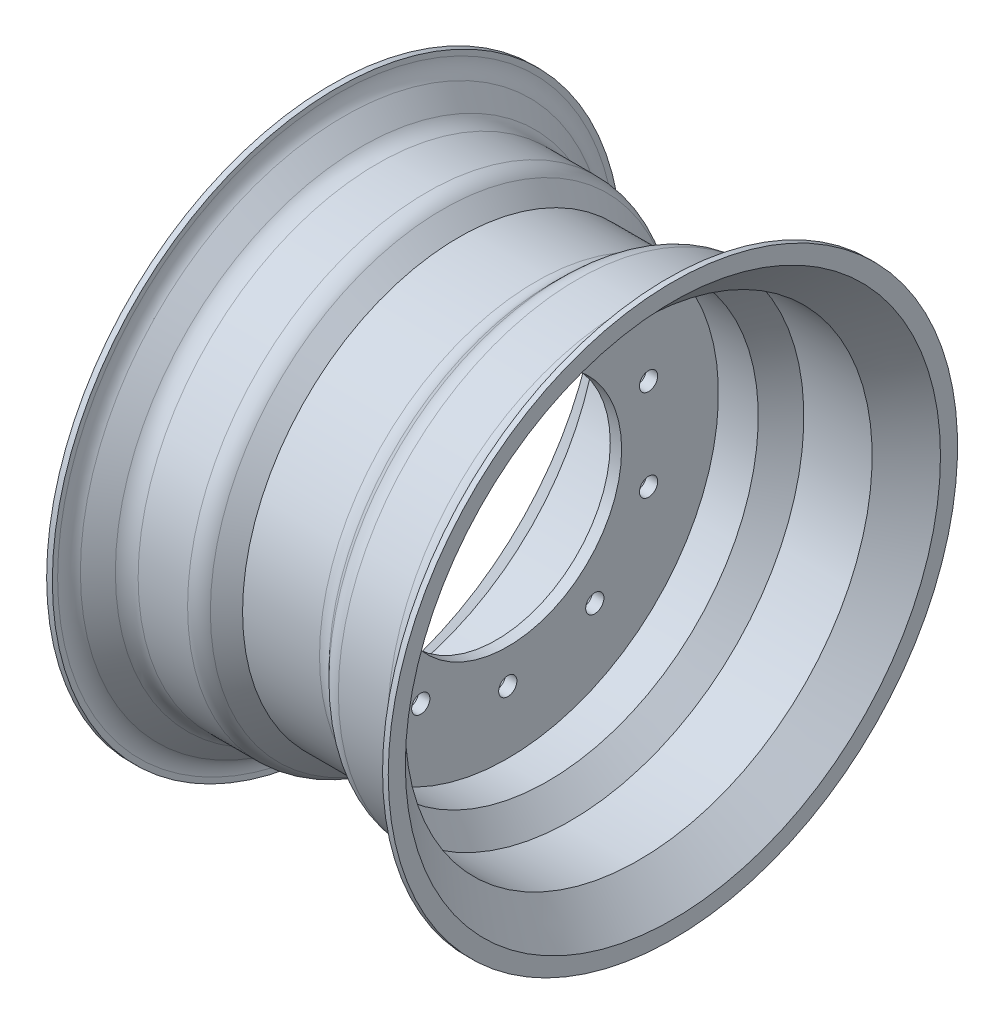
ISO-10303-21;
HEADER;
FILE_DESCRIPTION(('STEP AP214'),'2;1');
FILE_NAME('part.step','',(''),(''),'','','');
FILE_SCHEMA(('AUTOMOTIVE_DESIGN { 1 0 10303 214 1 1 1 1 }'));
ENDSEC;
DATA;
#1=APPLICATION_CONTEXT('core data for automotive mechanical design processes');
#2=APPLICATION_PROTOCOL_DEFINITION('international standard','automotive_design',2000,#1);
#3=PRODUCT_CONTEXT('',#1,'mechanical');
#4=PRODUCT('Part','Part','',(#3));
#5=PRODUCT_RELATED_PRODUCT_CATEGORY('part','',(#4));
#6=PRODUCT_DEFINITION_FORMATION('','',#4);
#7=PRODUCT_DEFINITION_CONTEXT('part definition',#1,'design');
#8=PRODUCT_DEFINITION('design','',#6,#7);
#9=PRODUCT_DEFINITION_SHAPE('','',#8);
#10=(LENGTH_UNIT() NAMED_UNIT(*) SI_UNIT(.MILLI.,.METRE.));
#11=(NAMED_UNIT(*) PLANE_ANGLE_UNIT() SI_UNIT($,.RADIAN.));
#12=(NAMED_UNIT(*) SI_UNIT($,.STERADIAN.) SOLID_ANGLE_UNIT());
#13=UNCERTAINTY_MEASURE_WITH_UNIT(LENGTH_MEASURE(1.E-05),#10,'distance_accuracy_value','');
#14=(GEOMETRIC_REPRESENTATION_CONTEXT(3) GLOBAL_UNCERTAINTY_ASSIGNED_CONTEXT((#13)) GLOBAL_UNIT_ASSIGNED_CONTEXT((#10,
#11,#12)) REPRESENTATION_CONTEXT('',''));
#15=CARTESIAN_POINT('',(0.,0.,0.));
#16=DIRECTION('',(0.,0.,1.));
#17=DIRECTION('',(1.,0.,0.));
#18=AXIS2_PLACEMENT_3D('',#15,#16,#17);
#19=CARTESIAN_POINT('',(-343.890956764091,0.,0.));
#20=DIRECTION('',(-1.,0.,0.));
#21=DIRECTION('',(0.,0.,1.));
#22=AXIS2_PLACEMENT_3D('',#19,#20,#21);
#23=CYLINDRICAL_SURFACE('',#22,250.);
#24=CARTESIAN_POINT('',(-150.,0.,0.));
#25=DIRECTION('',(-1.,0.,0.));
#26=DIRECTION('',(0.,0.,1.));
#27=AXIS2_PLACEMENT_3D('',#24,#25,#26);
#28=CIRCLE('',#27,250.);
#29=CARTESIAN_POINT('',(-150.,0.,250.));
#30=VERTEX_POINT('',#29);
#31=EDGE_CURVE('E142',#30,#30,#28,.T.);
#32=ORIENTED_EDGE('',*,*,#31,.F.);
#33=EDGE_LOOP('',(#32));
#34=FACE_BOUND('',#33,.T.);
#35=CARTESIAN_POINT('',(-145.,0.,0.));
#36=DIRECTION('',(-1.,0.,0.));
#37=DIRECTION('',(0.,0.,1.));
#38=AXIS2_PLACEMENT_3D('',#35,#36,#37);
#39=CIRCLE('',#38,250.);
#40=CARTESIAN_POINT('',(-145.,0.,250.));
#41=VERTEX_POINT('',#40);
#42=EDGE_CURVE('E97',#41,#41,#39,.T.);
#43=ORIENTED_EDGE('',*,*,#42,.T.);
#44=EDGE_LOOP('',(#43));
#45=FACE_BOUND('',#44,.T.);
#46=ADVANCED_FACE('F41',(#34,#45),#23,.T.);
#47=CARTESIAN_POINT('',(-145.,250.,0.));
#48=DIRECTION('',(-1.,0.,0.));
#49=DIRECTION('',(0.,0.,1.));
#50=AXIS2_PLACEMENT_3D('',#47,#48,#49);
#51=PLANE('',#50);
#52=CARTESIAN_POINT('',(-145.,0.,0.));
#53=DIRECTION('',(-1.,0.,0.));
#54=DIRECTION('',(0.,0.,1.));
#55=AXIS2_PLACEMENT_3D('',#52,#53,#54);
#56=CIRCLE('',#55,245.355339059327);
#57=CARTESIAN_POINT('',(-145.,0.,245.355339059327));
#58=VERTEX_POINT('',#57);
#59=EDGE_CURVE('E94',#58,#58,#56,.T.);
#60=ORIENTED_EDGE('',*,*,#59,.T.);
#61=EDGE_LOOP('',(#60));
#62=FACE_BOUND('',#61,.T.);
#63=ORIENTED_EDGE('',*,*,#42,.F.);
#64=EDGE_LOOP('',(#63));
#65=FACE_BOUND('',#64,.T.);
#66=ADVANCED_FACE('F243',(#62,#65),#51,.F.);
#67=CARTESIAN_POINT('',(-117.928932188135,0.,0.));
#68=DIRECTION('',(-1.,0.,0.));
#69=DIRECTION('',(0.,0.,1.));
#70=AXIS2_PLACEMENT_3D('',#67,#68,#69);
#71=CONICAL_SURFACE('',#70,210.,0.785398163397448);
#72=CARTESIAN_POINT('',(-139.142135623731,0.,0.));
#73=DIRECTION('',(-1.,0.,0.));
#74=DIRECTION('',(0.,0.,1.));
#75=AXIS2_PLACEMENT_3D('',#72,#73,#74);
#76=CIRCLE('',#75,231.213203435596);
#77=CARTESIAN_POINT('',(-139.142135623731,0.,231.213203435596));
#78=VERTEX_POINT('',#77);
#79=EDGE_CURVE('E88',#78,#78,#76,.F.);
#80=ORIENTED_EDGE('',*,*,#79,.T.);
#81=EDGE_LOOP('',(#80));
#82=FACE_BOUND('',#81,.T.);
#83=CARTESIAN_POINT('',(-123.786796564404,0.,0.));
#84=DIRECTION('',(-1.,0.,0.));
#85=DIRECTION('',(0.,0.,1.));
#86=AXIS2_PLACEMENT_3D('',#83,#84,#85);
#87=CIRCLE('',#86,215.857864376269);
#88=CARTESIAN_POINT('',(-123.786796564404,0.,215.857864376269));
#89=VERTEX_POINT('',#88);
#90=EDGE_CURVE('E91',#89,#89,#87,.T.);
#91=ORIENTED_EDGE('',*,*,#90,.T.);
#92=EDGE_LOOP('',(#91));
#93=FACE_BOUND('',#92,.T.);
#94=ADVANCED_FACE('F249',(#82,#93),#71,.T.);
#95=CARTESIAN_POINT('',(-343.890956764091,0.,0.));
#96=DIRECTION('',(-1.,0.,0.));
#97=DIRECTION('',(0.,0.,1.));
#98=AXIS2_PLACEMENT_3D('',#95,#96,#97);
#99=CYLINDRICAL_SURFACE('',#98,210.);
#100=CARTESIAN_POINT('',(-109.644660940673,0.,0.));
#101=DIRECTION('',(-1.,0.,0.));
#102=DIRECTION('',(0.,0.,1.));
#103=AXIS2_PLACEMENT_3D('',#100,#101,#102);
#104=CIRCLE('',#103,210.);
#105=CARTESIAN_POINT('',(-109.644660940673,0.,210.));
#106=VERTEX_POINT('',#105);
#107=EDGE_CURVE('E82',#106,#106,#104,.F.);
#108=ORIENTED_EDGE('',*,*,#107,.T.);
#109=EDGE_LOOP('',(#108));
#110=FACE_BOUND('',#109,.T.);
#111=CARTESIAN_POINT('',(-66.2132034355965,0.,0.));
#112=DIRECTION('',(1.,0.,0.));
#113=DIRECTION('',(0.,0.,-1.));
#114=AXIS2_PLACEMENT_3D('',#111,#112,#113);
#115=CIRCLE('',#114,210.);
#116=CARTESIAN_POINT('',(-66.2132034355965,0.,-210.));
#117=VERTEX_POINT('',#116);
#118=EDGE_CURVE('E85',#117,#117,#115,.F.);
#119=ORIENTED_EDGE('',*,*,#118,.T.);
#120=EDGE_LOOP('',(#119));
#121=FACE_BOUND('',#120,.T.);
#122=ADVANCED_FACE('F314',(#110,#121),#99,.T.);
#123=CARTESIAN_POINT('',(-37.9289321881346,0.,0.));
#124=DIRECTION('',(-1.,0.,0.));
#125=DIRECTION('',(0.,0.,1.));
#126=AXIS2_PLACEMENT_3D('',#123,#124,#125);
#127=CONICAL_SURFACE('',#126,190.,0.785398163397448);
#128=CARTESIAN_POINT('',(-52.0710678118656,0.,0.));
#129=DIRECTION('',(1.,0.,0.));
#130=DIRECTION('',(0.,0.,-1.));
#131=AXIS2_PLACEMENT_3D('',#128,#129,#130);
#132=CIRCLE('',#131,204.142135623731);
#133=CARTESIAN_POINT('',(-52.0710678118656,0.,-204.142135623731));
#134=VERTEX_POINT('',#133);
#135=EDGE_CURVE('E79',#134,#134,#132,.T.);
#136=ORIENTED_EDGE('',*,*,#135,.T.);
#137=EDGE_LOOP('',(#136));
#138=FACE_BOUND('',#137,.T.);
#139=CARTESIAN_POINT('',(-37.9289321881346,0.,0.));
#140=DIRECTION('',(-1.,0.,0.));
#141=DIRECTION('',(0.,0.,1.));
#142=AXIS2_PLACEMENT_3D('',#139,#140,#141);
#143=CIRCLE('',#142,190.);
#144=CARTESIAN_POINT('',(-37.9289321881346,0.,190.));
#145=VERTEX_POINT('',#144);
#146=EDGE_CURVE('E100',#145,#145,#143,.T.);
#147=ORIENTED_EDGE('',*,*,#146,.T.);
#148=EDGE_LOOP('',(#147));
#149=FACE_BOUND('',#148,.T.);
#150=ADVANCED_FACE('F310',(#138,#149),#127,.T.);
#151=CARTESIAN_POINT('',(-343.890956764091,0.,0.));
#152=DIRECTION('',(-1.,0.,0.));
#153=DIRECTION('',(0.,0.,1.));
#154=AXIS2_PLACEMENT_3D('',#151,#152,#153);
#155=CYLINDRICAL_SURFACE('',#154,190.);
#156=CARTESIAN_POINT('',(29.6446609406727,0.,0.));
#157=DIRECTION('',(-1.,0.,0.));
#158=DIRECTION('',(0.,0.,1.));
#159=AXIS2_PLACEMENT_3D('',#156,#157,#158);
#160=CIRCLE('',#159,190.);
#161=CARTESIAN_POINT('',(29.6446609406727,0.,190.));
#162=VERTEX_POINT('',#161);
#163=EDGE_CURVE('E70',#162,#162,#160,.T.);
#164=ORIENTED_EDGE('',*,*,#163,.T.);
#165=EDGE_LOOP('',(#164));
#166=FACE_BOUND('',#165,.T.);
#167=ORIENTED_EDGE('',*,*,#146,.F.);
#168=EDGE_LOOP('',(#167));
#169=FACE_BOUND('',#168,.T.);
#170=ADVANCED_FACE('F303',(#166,#169),#155,.T.);
#171=CARTESIAN_POINT('',(57.9289321881346,0.,0.));
#172=DIRECTION('',(1.,0.,0.));
#173=DIRECTION('',(0.,0.,-1.));
#174=AXIS2_PLACEMENT_3D('',#171,#172,#173);
#175=CONICAL_SURFACE('',#174,210.,0.785398163397448);
#176=CARTESIAN_POINT('',(43.7867965644037,0.,0.));
#177=DIRECTION('',(1.,0.,0.));
#178=DIRECTION('',(0.,0.,-1.));
#179=AXIS2_PLACEMENT_3D('',#176,#177,#178);
#180=CIRCLE('',#179,195.857864376269);
#181=CARTESIAN_POINT('',(43.7867965644037,0.,-195.857864376269));
#182=VERTEX_POINT('',#181);
#183=EDGE_CURVE('E64',#182,#182,#180,.T.);
#184=ORIENTED_EDGE('',*,*,#183,.T.);
#185=EDGE_LOOP('',(#184));
#186=FACE_BOUND('',#185,.T.);
#187=CARTESIAN_POINT('',(52.0710678118656,0.,0.));
#188=DIRECTION('',(-1.,0.,0.));
#189=DIRECTION('',(0.,0.,1.));
#190=AXIS2_PLACEMENT_3D('',#187,#188,#189);
#191=CIRCLE('',#190,204.142135623731);
#192=CARTESIAN_POINT('',(52.0710678118656,0.,204.142135623731));
#193=VERTEX_POINT('',#192);
#194=EDGE_CURVE('E67',#193,#193,#191,.T.);
#195=ORIENTED_EDGE('',*,*,#194,.T.);
#196=EDGE_LOOP('',(#195));
#197=FACE_BOUND('',#196,.T.);
#198=ADVANCED_FACE('F294',(#186,#197),#175,.T.);
#199=CARTESIAN_POINT('',(-343.890956764091,0.,0.));
#200=DIRECTION('',(-1.,0.,0.));
#201=DIRECTION('',(0.,0.,1.));
#202=AXIS2_PLACEMENT_3D('',#199,#200,#201);
#203=CYLINDRICAL_SURFACE('',#202,210.);
#204=CARTESIAN_POINT('',(66.2132034355965,0.,0.));
#205=DIRECTION('',(1.,0.,0.));
#206=DIRECTION('',(0.,0.,-1.));
#207=AXIS2_PLACEMENT_3D('',#204,#205,#206);
#208=CIRCLE('',#207,210.);
#209=CARTESIAN_POINT('',(66.2132034355965,0.,-210.));
#210=VERTEX_POINT('',#209);
#211=EDGE_CURVE('E56',#210,#210,#208,.T.);
#212=ORIENTED_EDGE('',*,*,#211,.T.);
#213=EDGE_LOOP('',(#212));
#214=FACE_BOUND('',#213,.T.);
#215=CARTESIAN_POINT('',(109.644660940673,0.,0.));
#216=DIRECTION('',(-1.,0.,0.));
#217=DIRECTION('',(0.,0.,1.));
#218=AXIS2_PLACEMENT_3D('',#215,#216,#217);
#219=CIRCLE('',#218,210.);
#220=CARTESIAN_POINT('',(109.644660940673,0.,210.));
#221=VERTEX_POINT('',#220);
#222=EDGE_CURVE('E61',#221,#221,#219,.T.);
#223=ORIENTED_EDGE('',*,*,#222,.T.);
#224=EDGE_LOOP('',(#223));
#225=FACE_BOUND('',#224,.T.);
#226=ADVANCED_FACE('F291',(#214,#225),#203,.T.);
#227=CARTESIAN_POINT('',(145.,0.,0.));
#228=DIRECTION('',(1.,0.,0.));
#229=DIRECTION('',(0.,0.,-1.));
#230=AXIS2_PLACEMENT_3D('',#227,#228,#229);
#231=CONICAL_SURFACE('',#230,237.071067811865,0.785398163397448);
#232=CARTESIAN_POINT('',(123.786796564404,0.,0.));
#233=DIRECTION('',(1.,0.,0.));
#234=DIRECTION('',(0.,0.,-1.));
#235=AXIS2_PLACEMENT_3D('',#232,#233,#234);
#236=CIRCLE('',#235,215.857864376269);
#237=CARTESIAN_POINT('',(123.786796564404,0.,-215.857864376269));
#238=VERTEX_POINT('',#237);
#239=EDGE_CURVE('E48',#238,#238,#236,.T.);
#240=ORIENTED_EDGE('',*,*,#239,.T.);
#241=EDGE_LOOP('',(#240));
#242=FACE_BOUND('',#241,.T.);
#243=CARTESIAN_POINT('',(139.142135623731,0.,0.));
#244=DIRECTION('',(1.,0.,0.));
#245=DIRECTION('',(0.,0.,-1.));
#246=AXIS2_PLACEMENT_3D('',#243,#244,#245);
#247=CIRCLE('',#246,231.213203435596);
#248=CARTESIAN_POINT('',(139.142135623731,0.,-231.213203435596));
#249=VERTEX_POINT('',#248);
#250=EDGE_CURVE('E52',#249,#249,#247,.F.);
#251=ORIENTED_EDGE('',*,*,#250,.T.);
#252=EDGE_LOOP('',(#251));
#253=FACE_BOUND('',#252,.T.);
#254=ADVANCED_FACE('F293',(#242,#253),#231,.T.);
#255=CARTESIAN_POINT('',(145.,250.,0.));
#256=DIRECTION('',(1.,0.,0.));
#257=DIRECTION('',(0.,0.,-1.));
#258=AXIS2_PLACEMENT_3D('',#255,#256,#257);
#259=PLANE('',#258);
#260=CARTESIAN_POINT('',(145.,0.,0.));
#261=DIRECTION('',(1.,0.,0.));
#262=DIRECTION('',(0.,0.,-1.));
#263=AXIS2_PLACEMENT_3D('',#260,#261,#262);
#264=CIRCLE('',#263,245.355339059327);
#265=CARTESIAN_POINT('',(145.,0.,-245.355339059327));
#266=VERTEX_POINT('',#265);
#267=EDGE_CURVE('E10',#266,#266,#264,.T.);
#268=ORIENTED_EDGE('',*,*,#267,.T.);
#269=EDGE_LOOP('',(#268));
#270=FACE_BOUND('',#269,.T.);
#271=CARTESIAN_POINT('',(145.,0.,0.));
#272=DIRECTION('',(-1.,0.,0.));
#273=DIRECTION('',(0.,0.,1.));
#274=AXIS2_PLACEMENT_3D('',#271,#272,#273);
#275=CIRCLE('',#274,250.);
#276=CARTESIAN_POINT('',(145.,0.,250.));
#277=VERTEX_POINT('',#276);
#278=EDGE_CURVE('E103',#277,#277,#275,.T.);
#279=ORIENTED_EDGE('',*,*,#278,.T.);
#280=EDGE_LOOP('',(#279));
#281=FACE_BOUND('',#280,.T.);
#282=ADVANCED_FACE('F301',(#270,#281),#259,.F.);
#283=CARTESIAN_POINT('',(-343.890956764091,0.,0.));
#284=DIRECTION('',(-1.,0.,0.));
#285=DIRECTION('',(0.,0.,1.));
#286=AXIS2_PLACEMENT_3D('',#283,#284,#285);
#287=CYLINDRICAL_SURFACE('',#286,250.);
#288=ORIENTED_EDGE('',*,*,#278,.F.);
#289=EDGE_LOOP('',(#288));
#290=FACE_BOUND('',#289,.T.);
#291=CARTESIAN_POINT('',(150.,0.,0.));
#292=DIRECTION('',(-1.,0.,0.));
#293=DIRECTION('',(0.,0.,1.));
#294=AXIS2_PLACEMENT_3D('',#291,#292,#293);
#295=CIRCLE('',#294,250.);
#296=CARTESIAN_POINT('',(150.,0.,250.));
#297=VERTEX_POINT('',#296);
#298=EDGE_CURVE('E106',#297,#297,#295,.T.);
#299=ORIENTED_EDGE('',*,*,#298,.T.);
#300=EDGE_LOOP('',(#299));
#301=FACE_BOUND('',#300,.T.);
#302=ADVANCED_FACE('F367',(#290,#301),#287,.T.);
#303=CARTESIAN_POINT('',(150.,250.,0.));
#304=DIRECTION('',(-1.,0.,0.));
#305=DIRECTION('',(0.,0.,1.));
#306=AXIS2_PLACEMENT_3D('',#303,#304,#305);
#307=PLANE('',#306);
#308=ORIENTED_EDGE('',*,*,#298,.F.);
#309=EDGE_LOOP('',(#308));
#310=FACE_BOUND('',#309,.T.);
#311=CARTESIAN_POINT('',(150.,0.,0.));
#312=DIRECTION('',(-1.,0.,0.));
#313=DIRECTION('',(0.,0.,1.));
#314=AXIS2_PLACEMENT_3D('',#311,#312,#313);
#315=CIRCLE('',#314,235.);
#316=CARTESIAN_POINT('',(150.,0.,235.));
#317=VERTEX_POINT('',#316);
#318=EDGE_CURVE('E109',#317,#317,#315,.T.);
#319=ORIENTED_EDGE('',*,*,#318,.T.);
#320=EDGE_LOOP('',(#319));
#321=FACE_BOUND('',#320,.T.);
#322=ADVANCED_FACE('F376',(#310,#321),#307,.F.);
#323=CARTESIAN_POINT('',(120.,0.,0.));
#324=DIRECTION('',(1.,0.,0.));
#325=DIRECTION('',(0.,0.,-1.));
#326=AXIS2_PLACEMENT_3D('',#323,#324,#325);
#327=CONICAL_SURFACE('',#326,205.,0.785398163397447);
#328=ORIENTED_EDGE('',*,*,#318,.F.);
#329=EDGE_LOOP('',(#328));
#330=FACE_BOUND('',#329,.T.);
#331=CARTESIAN_POINT('',(120.,0.,0.));
#332=DIRECTION('',(-1.,0.,0.));
#333=DIRECTION('',(0.,0.,1.));
#334=AXIS2_PLACEMENT_3D('',#331,#332,#333);
#335=CIRCLE('',#334,205.);
#336=CARTESIAN_POINT('',(120.,0.,205.));
#337=VERTEX_POINT('',#336);
#338=EDGE_CURVE('E112',#337,#337,#335,.T.);
#339=ORIENTED_EDGE('',*,*,#338,.T.);
#340=EDGE_LOOP('',(#339));
#341=FACE_BOUND('',#340,.T.);
#342=ADVANCED_FACE('F387',(#330,#341),#327,.F.);
#343=CARTESIAN_POINT('',(-343.890956764091,0.,0.));
#344=DIRECTION('',(-1.,0.,0.));
#345=DIRECTION('',(0.,0.,1.));
#346=AXIS2_PLACEMENT_3D('',#343,#344,#345);
#347=CYLINDRICAL_SURFACE('',#346,205.);
#348=ORIENTED_EDGE('',*,*,#338,.F.);
#349=EDGE_LOOP('',(#348));
#350=FACE_BOUND('',#349,.T.);
#351=CARTESIAN_POINT('',(60.,0.,0.));
#352=DIRECTION('',(-1.,0.,0.));
#353=DIRECTION('',(0.,0.,1.));
#354=AXIS2_PLACEMENT_3D('',#351,#352,#353);
#355=CIRCLE('',#354,205.);
#356=CARTESIAN_POINT('',(60.,0.,205.));
#357=VERTEX_POINT('',#356);
#358=EDGE_CURVE('E115',#357,#357,#355,.T.);
#359=ORIENTED_EDGE('',*,*,#358,.T.);
#360=EDGE_LOOP('',(#359));
#361=FACE_BOUND('',#360,.T.);
#362=ADVANCED_FACE('F397',(#350,#361),#347,.F.);
#363=CARTESIAN_POINT('',(40.,0.,0.));
#364=DIRECTION('',(1.,0.,0.));
#365=DIRECTION('',(0.,0.,-1.));
#366=AXIS2_PLACEMENT_3D('',#363,#364,#365);
#367=CONICAL_SURFACE('',#366,185.,0.785398163397446);
#368=ORIENTED_EDGE('',*,*,#358,.F.);
#369=EDGE_LOOP('',(#368));
#370=FACE_BOUND('',#369,.T.);
#371=CARTESIAN_POINT('',(40.,0.,0.));
#372=DIRECTION('',(-1.,0.,0.));
#373=DIRECTION('',(0.,0.,1.));
#374=AXIS2_PLACEMENT_3D('',#371,#372,#373);
#375=CIRCLE('',#374,185.);
#376=CARTESIAN_POINT('',(40.,0.,185.));
#377=VERTEX_POINT('',#376);
#378=EDGE_CURVE('E118',#377,#377,#375,.T.);
#379=ORIENTED_EDGE('',*,*,#378,.T.);
#380=EDGE_LOOP('',(#379));
#381=FACE_BOUND('',#380,.T.);
#382=ADVANCED_FACE('F407',(#370,#381),#367,.F.);
#383=CARTESIAN_POINT('',(-343.890956764091,0.,0.));
#384=DIRECTION('',(-1.,0.,0.));
#385=DIRECTION('',(0.,0.,1.));
#386=AXIS2_PLACEMENT_3D('',#383,#384,#385);
#387=CYLINDRICAL_SURFACE('',#386,185.);
#388=ORIENTED_EDGE('',*,*,#378,.F.);
#389=EDGE_LOOP('',(#388));
#390=FACE_BOUND('',#389,.T.);
#391=CARTESIAN_POINT('',(5.,0.,0.));
#392=DIRECTION('',(-1.,0.,0.));
#393=DIRECTION('',(0.,0.,1.));
#394=AXIS2_PLACEMENT_3D('',#391,#392,#393);
#395=CIRCLE('',#394,185.);
#396=CARTESIAN_POINT('',(5.,0.,185.));
#397=VERTEX_POINT('',#396);
#398=EDGE_CURVE('E121',#397,#397,#395,.T.);
#399=ORIENTED_EDGE('',*,*,#398,.T.);
#400=EDGE_LOOP('',(#399));
#401=FACE_BOUND('',#400,.T.);
#402=ADVANCED_FACE('F417',(#390,#401),#387,.F.);
#403=CARTESIAN_POINT('',(4.99999999999999,185.,0.));
#404=DIRECTION('',(-1.,0.,0.));
#405=DIRECTION('',(0.,0.,1.));
#406=AXIS2_PLACEMENT_3D('',#403,#404,#405);
#407=PLANE('',#406);
#408=CARTESIAN_POINT('',(4.99999999999999,105.172209268744,76.4120827980201));
#409=DIRECTION('',(-1.,0.,0.));
#410=DIRECTION('',(0.,-0.587785252292462,0.809016994374955));
#411=AXIS2_PLACEMENT_3D('',#408,#409,#410);
#412=CIRCLE('',#411,8.);
#413=CARTESIAN_POINT('',(4.99999999999999,100.469927250404,82.8842187530198));
#414=VERTEX_POINT('',#413);
#415=EDGE_CURVE('E161',#414,#414,#412,.T.);
#416=ORIENTED_EDGE('',*,*,#415,.T.);
#417=EDGE_LOOP('',(#416));
#418=FACE_BOUND('',#417,.T.);
#419=CARTESIAN_POINT('',(4.99999999999999,40.1722092687446,123.63734711837));
#420=DIRECTION('',(-1.,0.,0.));
#421=DIRECTION('',(0.,-0.95105651629515,0.309016994374958));
#422=AXIS2_PLACEMENT_3D('',#419,#420,#421);
#423=CIRCLE('',#422,8.);
#424=CARTESIAN_POINT('',(4.99999999999999,32.5637571383834,126.109483073369));
#425=VERTEX_POINT('',#424);
#426=EDGE_CURVE('E167',#425,#425,#423,.T.);
#427=ORIENTED_EDGE('',*,*,#426,.T.);
#428=EDGE_LOOP('',(#427));
#429=FACE_BOUND('',#428,.T.);
#430=CARTESIAN_POINT('',(4.99999999999999,-40.172209268742,123.63734711837));
#431=DIRECTION('',(-1.,0.,0.));
#432=DIRECTION('',(0.,-0.951056516295157,-0.309016994374938));
#433=AXIS2_PLACEMENT_3D('',#430,#431,#432);
#434=CIRCLE('',#433,8.);
#435=CARTESIAN_POINT('',(4.99999999999999,-47.7806613991032,121.165211163371));
#436=VERTEX_POINT('',#435);
#437=EDGE_CURVE('E173',#436,#436,#434,.T.);
#438=ORIENTED_EDGE('',*,*,#437,.T.);
#439=EDGE_LOOP('',(#438));
#440=FACE_BOUND('',#439,.T.);
#441=CARTESIAN_POINT('',(4.99999999999999,-105.172209268742,76.4120827980224));
#442=DIRECTION('',(-1.,0.,0.));
#443=DIRECTION('',(0.,-0.58778525229248,-0.809016994374942));
#444=AXIS2_PLACEMENT_3D('',#441,#442,#443);
#445=CIRCLE('',#444,8.);
#446=CARTESIAN_POINT('',(4.99999999999999,-109.874491287082,69.9399468430229));
#447=VERTEX_POINT('',#446);
#448=EDGE_CURVE('E179',#447,#447,#445,.T.);
#449=ORIENTED_EDGE('',*,*,#448,.T.);
#450=EDGE_LOOP('',(#449));
#451=FACE_BOUND('',#450,.T.);
#452=CARTESIAN_POINT('',(4.99999999999999,-130.,0.));
#453=DIRECTION('',(-1.,0.,0.));
#454=DIRECTION('',(0.,0.,-1.));
#455=AXIS2_PLACEMENT_3D('',#452,#453,#454);
#456=CIRCLE('',#455,8.);
#457=CARTESIAN_POINT('',(4.99999999999999,-130.,-8.));
#458=VERTEX_POINT('',#457);
#459=EDGE_CURVE('E185',#458,#458,#456,.T.);
#460=ORIENTED_EDGE('',*,*,#459,.T.);
#461=EDGE_LOOP('',(#460));
#462=FACE_BOUND('',#461,.T.);
#463=CARTESIAN_POINT('',(4.99999999999999,-105.172209268744,-76.4120827980209));
#464=DIRECTION('',(-1.,0.,0.));
#465=DIRECTION('',(0.,0.587785252292469,-0.809016994374951));
#466=AXIS2_PLACEMENT_3D('',#463,#464,#465);
#467=CIRCLE('',#466,8.);
#468=CARTESIAN_POINT('',(4.99999999999999,-100.469927250404,-82.8842187530205));
#469=VERTEX_POINT('',#468);
#470=EDGE_CURVE('E191',#469,#469,#467,.T.);
#471=ORIENTED_EDGE('',*,*,#470,.T.);
#472=EDGE_LOOP('',(#471));
#473=FACE_BOUND('',#472,.T.);
#474=CARTESIAN_POINT('',(4.99999999999999,-40.1722092687437,-123.63734711837));
#475=DIRECTION('',(-1.,0.,0.));
#476=DIRECTION('',(0.,0.951056516295152,-0.309016994374952));
#477=AXIS2_PLACEMENT_3D('',#474,#475,#476);
#478=CIRCLE('',#477,8.);
#479=CARTESIAN_POINT('',(4.99999999999999,-32.5637571383825,-126.109483073369));
#480=VERTEX_POINT('',#479);
#481=EDGE_CURVE('E197',#480,#480,#478,.T.);
#482=ORIENTED_EDGE('',*,*,#481,.T.);
#483=EDGE_LOOP('',(#482));
#484=FACE_BOUND('',#483,.T.);
#485=CARTESIAN_POINT('',(4.99999999999999,40.1722092687428,-123.63734711837));
#486=DIRECTION('',(-1.,0.,0.));
#487=DIRECTION('',(0.,0.951056516295155,0.309016994374945));
#488=AXIS2_PLACEMENT_3D('',#485,#486,#487);
#489=CIRCLE('',#488,8.);
#490=CARTESIAN_POINT('',(4.99999999999999,47.7806613991041,-121.165211163371));
#491=VERTEX_POINT('',#490);
#492=EDGE_CURVE('E155',#491,#491,#489,.T.);
#493=ORIENTED_EDGE('',*,*,#492,.T.);
#494=EDGE_LOOP('',(#493));
#495=FACE_BOUND('',#494,.T.);
#496=CARTESIAN_POINT('',(4.99999999999999,105.172209268743,-76.4120827980217));
#497=DIRECTION('',(-1.,0.,0.));
#498=DIRECTION('',(0.,0.587785252292474,0.809016994374947));
#499=AXIS2_PLACEMENT_3D('',#496,#497,#498);
#500=CIRCLE('',#499,8.);
#501=CARTESIAN_POINT('',(4.99999999999999,109.874491287083,-69.9399468430221));
#502=VERTEX_POINT('',#501);
#503=EDGE_CURVE('E149',#502,#502,#500,.T.);
#504=ORIENTED_EDGE('',*,*,#503,.T.);
#505=EDGE_LOOP('',(#504));
#506=FACE_BOUND('',#505,.T.);
#507=CARTESIAN_POINT('',(4.99999999999999,130.,0.));
#508=DIRECTION('',(-1.,0.,0.));
#509=DIRECTION('',(0.,0.,1.));
#510=AXIS2_PLACEMENT_3D('',#507,#508,#509);
#511=CIRCLE('',#510,8.);
#512=CARTESIAN_POINT('',(4.99999999999999,130.,8.));
#513=VERTEX_POINT('',#512);
#514=EDGE_CURVE('E145',#513,#513,#511,.T.);
#515=ORIENTED_EDGE('',*,*,#514,.T.);
#516=EDGE_LOOP('',(#515));
#517=FACE_BOUND('',#516,.T.);
#518=ORIENTED_EDGE('',*,*,#398,.F.);
#519=EDGE_LOOP('',(#518));
#520=FACE_BOUND('',#519,.T.);
#521=CARTESIAN_POINT('',(5.,0.,0.));
#522=DIRECTION('',(-1.,0.,0.));
#523=DIRECTION('',(0.,0.,1.));
#524=AXIS2_PLACEMENT_3D('',#521,#522,#523);
#525=CIRCLE('',#524,100.);
#526=CARTESIAN_POINT('',(5.,0.,100.));
#527=VERTEX_POINT('',#526);
#528=EDGE_CURVE('E124',#527,#527,#525,.T.);
#529=ORIENTED_EDGE('',*,*,#528,.T.);
#530=EDGE_LOOP('',(#529));
#531=FACE_BOUND('',#530,.T.);
#532=ADVANCED_FACE('F206',(#418,#429,#440,#451,#462,#473,#484,#495,#506,#517,#520,#531),#407,.F.);
#533=CARTESIAN_POINT('',(-343.890956764091,0.,0.));
#534=DIRECTION('',(-1.,0.,0.));
#535=DIRECTION('',(0.,0.,1.));
#536=AXIS2_PLACEMENT_3D('',#533,#534,#535);
#537=CYLINDRICAL_SURFACE('',#536,100.);
#538=ORIENTED_EDGE('',*,*,#528,.F.);
#539=EDGE_LOOP('',(#538));
#540=FACE_BOUND('',#539,.T.);
#541=CARTESIAN_POINT('',(-5.,0.,0.));
#542=DIRECTION('',(-1.,0.,0.));
#543=DIRECTION('',(0.,0.,1.));
#544=AXIS2_PLACEMENT_3D('',#541,#542,#543);
#545=CIRCLE('',#544,100.);
#546=CARTESIAN_POINT('',(-5.,0.,100.));
#547=VERTEX_POINT('',#546);
#548=EDGE_CURVE('E127',#547,#547,#545,.T.);
#549=ORIENTED_EDGE('',*,*,#548,.T.);
#550=EDGE_LOOP('',(#549));
#551=FACE_BOUND('',#550,.T.);
#552=ADVANCED_FACE('F221',(#540,#551),#537,.F.);
#553=CARTESIAN_POINT('',(-5.00000000000001,185.,0.));
#554=DIRECTION('',(1.,0.,0.));
#555=DIRECTION('',(0.,0.,-1.));
#556=AXIS2_PLACEMENT_3D('',#553,#554,#555);
#557=PLANE('',#556);
#558=CARTESIAN_POINT('',(-5.00000000000001,105.172209268744,76.4120827980201));
#559=DIRECTION('',(-1.,0.,0.));
#560=DIRECTION('',(0.,-0.587785252292462,0.809016994374955));
#561=AXIS2_PLACEMENT_3D('',#558,#559,#560);
#562=CIRCLE('',#561,8.);
#563=CARTESIAN_POINT('',(-5.00000000000001,100.469927250404,82.8842187530198));
#564=VERTEX_POINT('',#563);
#565=EDGE_CURVE('E158',#564,#564,#562,.T.);
#566=ORIENTED_EDGE('',*,*,#565,.F.);
#567=EDGE_LOOP('',(#566));
#568=FACE_BOUND('',#567,.T.);
#569=CARTESIAN_POINT('',(-5.00000000000001,40.1722092687446,123.63734711837));
#570=DIRECTION('',(-1.,0.,0.));
#571=DIRECTION('',(0.,-0.95105651629515,0.309016994374958));
#572=AXIS2_PLACEMENT_3D('',#569,#570,#571);
#573=CIRCLE('',#572,8.);
#574=CARTESIAN_POINT('',(-5.00000000000001,32.5637571383834,126.109483073369));
#575=VERTEX_POINT('',#574);
#576=EDGE_CURVE('E164',#575,#575,#573,.T.);
#577=ORIENTED_EDGE('',*,*,#576,.F.);
#578=EDGE_LOOP('',(#577));
#579=FACE_BOUND('',#578,.T.);
#580=CARTESIAN_POINT('',(-5.00000000000001,-40.172209268742,123.63734711837));
#581=DIRECTION('',(-1.,0.,0.));
#582=DIRECTION('',(0.,-0.951056516295157,-0.309016994374938));
#583=AXIS2_PLACEMENT_3D('',#580,#581,#582);
#584=CIRCLE('',#583,8.);
#585=CARTESIAN_POINT('',(-5.00000000000001,-47.7806613991032,121.165211163371));
#586=VERTEX_POINT('',#585);
#587=EDGE_CURVE('E170',#586,#586,#584,.T.);
#588=ORIENTED_EDGE('',*,*,#587,.F.);
#589=EDGE_LOOP('',(#588));
#590=FACE_BOUND('',#589,.T.);
#591=CARTESIAN_POINT('',(-5.00000000000001,-105.172209268742,76.4120827980224));
#592=DIRECTION('',(-1.,0.,0.));
#593=DIRECTION('',(0.,-0.58778525229248,-0.809016994374942));
#594=AXIS2_PLACEMENT_3D('',#591,#592,#593);
#595=CIRCLE('',#594,8.);
#596=CARTESIAN_POINT('',(-5.00000000000001,-109.874491287082,69.9399468430229));
#597=VERTEX_POINT('',#596);
#598=EDGE_CURVE('E176',#597,#597,#595,.T.);
#599=ORIENTED_EDGE('',*,*,#598,.F.);
#600=EDGE_LOOP('',(#599));
#601=FACE_BOUND('',#600,.T.);
#602=CARTESIAN_POINT('',(-5.00000000000001,-130.,0.));
#603=DIRECTION('',(-1.,0.,0.));
#604=DIRECTION('',(0.,0.,-1.));
#605=AXIS2_PLACEMENT_3D('',#602,#603,#604);
#606=CIRCLE('',#605,8.);
#607=CARTESIAN_POINT('',(-5.00000000000001,-130.,-8.));
#608=VERTEX_POINT('',#607);
#609=EDGE_CURVE('E182',#608,#608,#606,.T.);
#610=ORIENTED_EDGE('',*,*,#609,.F.);
#611=EDGE_LOOP('',(#610));
#612=FACE_BOUND('',#611,.T.);
#613=CARTESIAN_POINT('',(-5.00000000000001,-105.172209268744,-76.4120827980209));
#614=DIRECTION('',(-1.,0.,0.));
#615=DIRECTION('',(0.,0.587785252292469,-0.809016994374951));
#616=AXIS2_PLACEMENT_3D('',#613,#614,#615);
#617=CIRCLE('',#616,8.);
#618=CARTESIAN_POINT('',(-5.00000000000001,-100.469927250404,-82.8842187530205));
#619=VERTEX_POINT('',#618);
#620=EDGE_CURVE('E188',#619,#619,#617,.T.);
#621=ORIENTED_EDGE('',*,*,#620,.F.);
#622=EDGE_LOOP('',(#621));
#623=FACE_BOUND('',#622,.T.);
#624=CARTESIAN_POINT('',(-5.00000000000001,-40.1722092687437,-123.63734711837));
#625=DIRECTION('',(-1.,0.,0.));
#626=DIRECTION('',(0.,0.951056516295152,-0.309016994374952));
#627=AXIS2_PLACEMENT_3D('',#624,#625,#626);
#628=CIRCLE('',#627,8.);
#629=CARTESIAN_POINT('',(-5.00000000000001,-32.5637571383825,-126.109483073369));
#630=VERTEX_POINT('',#629);
#631=EDGE_CURVE('E194',#630,#630,#628,.T.);
#632=ORIENTED_EDGE('',*,*,#631,.F.);
#633=EDGE_LOOP('',(#632));
#634=FACE_BOUND('',#633,.T.);
#635=CARTESIAN_POINT('',(-5.00000000000001,40.1722092687428,-123.63734711837));
#636=DIRECTION('',(-1.,0.,0.));
#637=DIRECTION('',(0.,0.951056516295155,0.309016994374945));
#638=AXIS2_PLACEMENT_3D('',#635,#636,#637);
#639=CIRCLE('',#638,8.);
#640=CARTESIAN_POINT('',(-5.00000000000001,47.7806613991041,-121.165211163371));
#641=VERTEX_POINT('',#640);
#642=EDGE_CURVE('E200',#641,#641,#639,.T.);
#643=ORIENTED_EDGE('',*,*,#642,.F.);
#644=EDGE_LOOP('',(#643));
#645=FACE_BOUND('',#644,.T.);
#646=CARTESIAN_POINT('',(-5.00000000000001,105.172209268743,-76.4120827980217));
#647=DIRECTION('',(-1.,0.,0.));
#648=DIRECTION('',(0.,0.587785252292474,0.809016994374947));
#649=AXIS2_PLACEMENT_3D('',#646,#647,#648);
#650=CIRCLE('',#649,8.);
#651=CARTESIAN_POINT('',(-5.00000000000001,109.874491287083,-69.9399468430221));
#652=VERTEX_POINT('',#651);
#653=EDGE_CURVE('E152',#652,#652,#650,.T.);
#654=ORIENTED_EDGE('',*,*,#653,.F.);
#655=EDGE_LOOP('',(#654));
#656=FACE_BOUND('',#655,.T.);
#657=CARTESIAN_POINT('',(-5.00000000000001,130.,0.));
#658=DIRECTION('',(-1.,0.,0.));
#659=DIRECTION('',(0.,0.,1.));
#660=AXIS2_PLACEMENT_3D('',#657,#658,#659);
#661=CIRCLE('',#660,8.);
#662=CARTESIAN_POINT('',(-5.00000000000001,130.,8.));
#663=VERTEX_POINT('',#662);
#664=EDGE_CURVE('E146',#663,#663,#661,.T.);
#665=ORIENTED_EDGE('',*,*,#664,.F.);
#666=EDGE_LOOP('',(#665));
#667=FACE_BOUND('',#666,.T.);
#668=ORIENTED_EDGE('',*,*,#548,.F.);
#669=EDGE_LOOP('',(#668));
#670=FACE_BOUND('',#669,.T.);
#671=CARTESIAN_POINT('',(-5.,0.,0.));
#672=DIRECTION('',(-1.,0.,0.));
#673=DIRECTION('',(0.,0.,1.));
#674=AXIS2_PLACEMENT_3D('',#671,#672,#673);
#675=CIRCLE('',#674,185.);
#676=CARTESIAN_POINT('',(-5.,0.,185.));
#677=VERTEX_POINT('',#676);
#678=EDGE_CURVE('E130',#677,#677,#675,.T.);
#679=ORIENTED_EDGE('',*,*,#678,.T.);
#680=EDGE_LOOP('',(#679));
#681=FACE_BOUND('',#680,.T.);
#682=ADVANCED_FACE('F217',(#568,#579,#590,#601,#612,#623,#634,#645,#656,#667,#670,#681),#557,.F.);
#683=CARTESIAN_POINT('',(-343.890956764091,0.,0.));
#684=DIRECTION('',(-1.,0.,0.));
#685=DIRECTION('',(0.,0.,1.));
#686=AXIS2_PLACEMENT_3D('',#683,#684,#685);
#687=CYLINDRICAL_SURFACE('',#686,185.);
#688=CARTESIAN_POINT('',(-31.7157287525381,0.,0.));
#689=DIRECTION('',(1.,0.,0.));
#690=DIRECTION('',(0.,0.,-1.));
#691=AXIS2_PLACEMENT_3D('',#688,#689,#690);
#692=CIRCLE('',#691,185.);
#693=CARTESIAN_POINT('',(-31.7157287525381,0.,-185.));
#694=VERTEX_POINT('',#693);
#695=EDGE_CURVE('E76',#694,#694,#692,.F.);
#696=ORIENTED_EDGE('',*,*,#695,.T.);
#697=EDGE_LOOP('',(#696));
#698=FACE_BOUND('',#697,.T.);
#699=ORIENTED_EDGE('',*,*,#678,.F.);
#700=EDGE_LOOP('',(#699));
#701=FACE_BOUND('',#700,.T.);
#702=ADVANCED_FACE('F220',(#698,#701),#687,.F.);
#703=CARTESIAN_POINT('',(-60.,0.,0.));
#704=DIRECTION('',(-1.,0.,0.));
#705=DIRECTION('',(0.,0.,1.));
#706=AXIS2_PLACEMENT_3D('',#703,#704,#705);
#707=CONICAL_SURFACE('',#706,205.,0.785398163397446);
#708=CARTESIAN_POINT('',(-45.857864376269,0.,0.));
#709=DIRECTION('',(1.,0.,0.));
#710=DIRECTION('',(0.,0.,-1.));
#711=AXIS2_PLACEMENT_3D('',#708,#709,#710);
#712=CIRCLE('',#711,190.857864376269);
#713=CARTESIAN_POINT('',(-45.857864376269,0.,-190.857864376269));
#714=VERTEX_POINT('',#713);
#715=EDGE_CURVE('E73',#714,#714,#712,.T.);
#716=ORIENTED_EDGE('',*,*,#715,.T.);
#717=EDGE_LOOP('',(#716));
#718=FACE_BOUND('',#717,.T.);
#719=CARTESIAN_POINT('',(-60.,0.,0.));
#720=DIRECTION('',(-1.,0.,0.));
#721=DIRECTION('',(0.,0.,1.));
#722=AXIS2_PLACEMENT_3D('',#719,#720,#721);
#723=CIRCLE('',#722,205.);
#724=CARTESIAN_POINT('',(-60.,0.,205.));
#725=VERTEX_POINT('',#724);
#726=EDGE_CURVE('E133',#725,#725,#723,.T.);
#727=ORIENTED_EDGE('',*,*,#726,.T.);
#728=EDGE_LOOP('',(#727));
#729=FACE_BOUND('',#728,.T.);
#730=ADVANCED_FACE('F233',(#718,#729),#707,.F.);
#731=CARTESIAN_POINT('',(-343.890956764091,0.,0.));
#732=DIRECTION('',(-1.,0.,0.));
#733=DIRECTION('',(0.,0.,1.));
#734=AXIS2_PLACEMENT_3D('',#731,#732,#733);
#735=CYLINDRICAL_SURFACE('',#734,205.);
#736=ORIENTED_EDGE('',*,*,#726,.F.);
#737=EDGE_LOOP('',(#736));
#738=FACE_BOUND('',#737,.T.);
#739=CARTESIAN_POINT('',(-120.,0.,0.));
#740=DIRECTION('',(-1.,0.,0.));
#741=DIRECTION('',(0.,0.,1.));
#742=AXIS2_PLACEMENT_3D('',#739,#740,#741);
#743=CIRCLE('',#742,205.);
#744=CARTESIAN_POINT('',(-120.,0.,205.));
#745=VERTEX_POINT('',#744);
#746=EDGE_CURVE('E136',#745,#745,#743,.T.);
#747=ORIENTED_EDGE('',*,*,#746,.T.);
#748=EDGE_LOOP('',(#747));
#749=FACE_BOUND('',#748,.T.);
#750=ADVANCED_FACE('F239',(#738,#749),#735,.F.);
#751=CARTESIAN_POINT('',(-150.,0.,0.));
#752=DIRECTION('',(-1.,0.,0.));
#753=DIRECTION('',(0.,0.,1.));
#754=AXIS2_PLACEMENT_3D('',#751,#752,#753);
#755=CONICAL_SURFACE('',#754,235.,0.785398163397447);
#756=ORIENTED_EDGE('',*,*,#746,.F.);
#757=EDGE_LOOP('',(#756));
#758=FACE_BOUND('',#757,.T.);
#759=CARTESIAN_POINT('',(-150.,0.,0.));
#760=DIRECTION('',(-1.,0.,0.));
#761=DIRECTION('',(0.,0.,1.));
#762=AXIS2_PLACEMENT_3D('',#759,#760,#761);
#763=CIRCLE('',#762,235.);
#764=CARTESIAN_POINT('',(-150.,0.,235.));
#765=VERTEX_POINT('',#764);
#766=EDGE_CURVE('E139',#765,#765,#763,.T.);
#767=ORIENTED_EDGE('',*,*,#766,.T.);
#768=EDGE_LOOP('',(#767));
#769=FACE_BOUND('',#768,.T.);
#770=ADVANCED_FACE('F472',(#758,#769),#755,.F.);
#771=CARTESIAN_POINT('',(-150.,250.,0.));
#772=DIRECTION('',(1.,0.,0.));
#773=DIRECTION('',(0.,0.,-1.));
#774=AXIS2_PLACEMENT_3D('',#771,#772,#773);
#775=PLANE('',#774);
#776=ORIENTED_EDGE('',*,*,#766,.F.);
#777=EDGE_LOOP('',(#776));
#778=FACE_BOUND('',#777,.T.);
#779=ORIENTED_EDGE('',*,*,#31,.T.);
#780=EDGE_LOOP('',(#779));
#781=FACE_BOUND('',#780,.T.);
#782=ADVANCED_FACE('F260',(#778,#781),#775,.F.);
#783=CARTESIAN_POINT('',(-125.,0.,0.));
#784=DIRECTION('',(-1.,0.,0.));
#785=DIRECTION('',(0.,0.,1.));
#786=AXIS2_PLACEMENT_3D('',#783,#784,#785);
#787=TOROIDAL_SURFACE('',#786,245.355339059327,20.);
#788=ORIENTED_EDGE('',*,*,#79,.F.);
#789=EDGE_LOOP('',(#788));
#790=FACE_BOUND('',#789,.T.);
#791=ORIENTED_EDGE('',*,*,#59,.F.);
#792=EDGE_LOOP('',(#791));
#793=FACE_BOUND('',#792,.T.);
#794=ADVANCED_FACE('F256',(#790,#793),#787,.F.);
#795=CARTESIAN_POINT('',(-109.644660940673,0.,0.));
#796=DIRECTION('',(-1.,0.,0.));
#797=DIRECTION('',(0.,0.,1.));
#798=AXIS2_PLACEMENT_3D('',#795,#796,#797);
#799=TOROIDAL_SURFACE('',#798,230.,20.);
#800=ORIENTED_EDGE('',*,*,#107,.F.);
#801=EDGE_LOOP('',(#800));
#802=FACE_BOUND('',#801,.T.);
#803=ORIENTED_EDGE('',*,*,#90,.F.);
#804=EDGE_LOOP('',(#803));
#805=FACE_BOUND('',#804,.T.);
#806=ADVANCED_FACE('F259',(#802,#805),#799,.F.);
#807=CARTESIAN_POINT('',(-66.2132034355965,0.,0.));
#808=DIRECTION('',(1.,0.,0.));
#809=DIRECTION('',(0.,0.,-1.));
#810=AXIS2_PLACEMENT_3D('',#807,#808,#809);
#811=TOROIDAL_SURFACE('',#810,190.,20.);
#812=ORIENTED_EDGE('',*,*,#135,.F.);
#813=EDGE_LOOP('',(#812));
#814=FACE_BOUND('',#813,.T.);
#815=ORIENTED_EDGE('',*,*,#118,.F.);
#816=EDGE_LOOP('',(#815));
#817=FACE_BOUND('',#816,.T.);
#818=ADVANCED_FACE('F264',(#814,#817),#811,.T.);
#819=CARTESIAN_POINT('',(-31.7157287525381,0.,0.));
#820=DIRECTION('',(1.,0.,0.));
#821=DIRECTION('',(0.,0.,-1.));
#822=AXIS2_PLACEMENT_3D('',#819,#820,#821);
#823=TOROIDAL_SURFACE('',#822,205.,20.);
#824=ORIENTED_EDGE('',*,*,#715,.F.);
#825=EDGE_LOOP('',(#824));
#826=FACE_BOUND('',#825,.T.);
#827=ORIENTED_EDGE('',*,*,#695,.F.);
#828=EDGE_LOOP('',(#827));
#829=FACE_BOUND('',#828,.T.);
#830=ADVANCED_FACE('F268',(#826,#829),#823,.T.);
#831=CARTESIAN_POINT('',(29.6446609406727,0.,0.));
#832=DIRECTION('',(-1.,0.,0.));
#833=DIRECTION('',(0.,0.,1.));
#834=AXIS2_PLACEMENT_3D('',#831,#832,#833);
#835=TOROIDAL_SURFACE('',#834,210.,20.);
#836=ORIENTED_EDGE('',*,*,#183,.F.);
#837=EDGE_LOOP('',(#836));
#838=FACE_BOUND('',#837,.T.);
#839=ORIENTED_EDGE('',*,*,#163,.F.);
#840=EDGE_LOOP('',(#839));
#841=FACE_BOUND('',#840,.T.);
#842=ADVANCED_FACE('F272',(#838,#841),#835,.F.);
#843=CARTESIAN_POINT('',(66.2132034355965,0.,0.));
#844=DIRECTION('',(1.,0.,0.));
#845=DIRECTION('',(0.,0.,-1.));
#846=AXIS2_PLACEMENT_3D('',#843,#844,#845);
#847=TOROIDAL_SURFACE('',#846,190.,20.);
#848=ORIENTED_EDGE('',*,*,#211,.F.);
#849=EDGE_LOOP('',(#848));
#850=FACE_BOUND('',#849,.T.);
#851=ORIENTED_EDGE('',*,*,#194,.F.);
#852=EDGE_LOOP('',(#851));
#853=FACE_BOUND('',#852,.T.);
#854=ADVANCED_FACE('F276',(#850,#853),#847,.T.);
#855=CARTESIAN_POINT('',(109.644660940673,0.,0.));
#856=DIRECTION('',(-1.,0.,0.));
#857=DIRECTION('',(0.,0.,1.));
#858=AXIS2_PLACEMENT_3D('',#855,#856,#857);
#859=TOROIDAL_SURFACE('',#858,230.,20.);
#860=ORIENTED_EDGE('',*,*,#239,.F.);
#861=EDGE_LOOP('',(#860));
#862=FACE_BOUND('',#861,.T.);
#863=ORIENTED_EDGE('',*,*,#222,.F.);
#864=EDGE_LOOP('',(#863));
#865=FACE_BOUND('',#864,.T.);
#866=ADVANCED_FACE('F279',(#862,#865),#859,.F.);
#867=CARTESIAN_POINT('',(125.,0.,0.));
#868=DIRECTION('',(1.,0.,0.));
#869=DIRECTION('',(0.,0.,-1.));
#870=AXIS2_PLACEMENT_3D('',#867,#868,#869);
#871=TOROIDAL_SURFACE('',#870,245.355339059327,20.);
#872=ORIENTED_EDGE('',*,*,#267,.F.);
#873=EDGE_LOOP('',(#872));
#874=FACE_BOUND('',#873,.T.);
#875=ORIENTED_EDGE('',*,*,#250,.F.);
#876=EDGE_LOOP('',(#875));
#877=FACE_BOUND('',#876,.T.);
#878=ADVANCED_FACE('F43',(#874,#877),#871,.F.);
#879=CARTESIAN_POINT('',(4.99999999999999,130.,0.));
#880=DIRECTION('',(-1.,0.,0.));
#881=DIRECTION('',(0.,0.,1.));
#882=AXIS2_PLACEMENT_3D('',#879,#880,#881);
#883=CYLINDRICAL_SURFACE('',#882,8.);
#884=ORIENTED_EDGE('',*,*,#514,.F.);
#885=EDGE_LOOP('',(#884));
#886=FACE_BOUND('',#885,.T.);
#887=ORIENTED_EDGE('',*,*,#664,.T.);
#888=EDGE_LOOP('',(#887));
#889=FACE_BOUND('',#888,.T.);
#890=ADVANCED_FACE('F286',(#886,#889),#883,.F.);
#891=CARTESIAN_POINT('',(4.99999999999999,105.172209268743,-76.4120827980217));
#892=DIRECTION('',(-1.,0.,0.));
#893=DIRECTION('',(0.,0.,1.));
#894=AXIS2_PLACEMENT_3D('',#891,#892,#893);
#895=CYLINDRICAL_SURFACE('',#894,8.);
#896=ORIENTED_EDGE('',*,*,#503,.F.);
#897=EDGE_LOOP('',(#896));
#898=FACE_BOUND('',#897,.T.);
#899=ORIENTED_EDGE('',*,*,#653,.T.);
#900=EDGE_LOOP('',(#899));
#901=FACE_BOUND('',#900,.T.);
#902=ADVANCED_FACE('F213',(#898,#901),#895,.F.);
#903=CARTESIAN_POINT('',(4.99999999999999,40.1722092687428,-123.63734711837));
#904=DIRECTION('',(-1.,0.,0.));
#905=DIRECTION('',(0.,0.,1.));
#906=AXIS2_PLACEMENT_3D('',#903,#904,#905);
#907=CYLINDRICAL_SURFACE('',#906,8.);
#908=ORIENTED_EDGE('',*,*,#492,.F.);
#909=EDGE_LOOP('',(#908));
#910=FACE_BOUND('',#909,.T.);
#911=ORIENTED_EDGE('',*,*,#642,.T.);
#912=EDGE_LOOP('',(#911));
#913=FACE_BOUND('',#912,.T.);
#914=ADVANCED_FACE('F209',(#910,#913),#907,.F.);
#915=CARTESIAN_POINT('',(4.99999999999999,-40.1722092687437,-123.63734711837));
#916=DIRECTION('',(-1.,0.,0.));
#917=DIRECTION('',(0.,0.,1.));
#918=AXIS2_PLACEMENT_3D('',#915,#916,#917);
#919=CYLINDRICAL_SURFACE('',#918,8.);
#920=ORIENTED_EDGE('',*,*,#481,.F.);
#921=EDGE_LOOP('',(#920));
#922=FACE_BOUND('',#921,.T.);
#923=ORIENTED_EDGE('',*,*,#631,.T.);
#924=EDGE_LOOP('',(#923));
#925=FACE_BOUND('',#924,.T.);
#926=ADVANCED_FACE('F212',(#922,#925),#919,.F.);
#927=CARTESIAN_POINT('',(4.99999999999999,-105.172209268744,-76.4120827980209));
#928=DIRECTION('',(-1.,0.,0.));
#929=DIRECTION('',(0.,0.,1.));
#930=AXIS2_PLACEMENT_3D('',#927,#928,#929);
#931=CYLINDRICAL_SURFACE('',#930,8.);
#932=ORIENTED_EDGE('',*,*,#470,.F.);
#933=EDGE_LOOP('',(#932));
#934=FACE_BOUND('',#933,.T.);
#935=ORIENTED_EDGE('',*,*,#620,.T.);
#936=EDGE_LOOP('',(#935));
#937=FACE_BOUND('',#936,.T.);
#938=ADVANCED_FACE('F568',(#934,#937),#931,.F.);
#939=CARTESIAN_POINT('',(4.99999999999999,-130.,0.));
#940=DIRECTION('',(-1.,0.,0.));
#941=DIRECTION('',(0.,0.,1.));
#942=AXIS2_PLACEMENT_3D('',#939,#940,#941);
#943=CYLINDRICAL_SURFACE('',#942,8.);
#944=ORIENTED_EDGE('',*,*,#459,.F.);
#945=EDGE_LOOP('',(#944));
#946=FACE_BOUND('',#945,.T.);
#947=ORIENTED_EDGE('',*,*,#609,.T.);
#948=EDGE_LOOP('',(#947));
#949=FACE_BOUND('',#948,.T.);
#950=ADVANCED_FACE('F578',(#946,#949),#943,.F.);
#951=CARTESIAN_POINT('',(4.99999999999999,-105.172209268742,76.4120827980224));
#952=DIRECTION('',(-1.,0.,0.));
#953=DIRECTION('',(0.,0.,1.));
#954=AXIS2_PLACEMENT_3D('',#951,#952,#953);
#955=CYLINDRICAL_SURFACE('',#954,8.);
#956=ORIENTED_EDGE('',*,*,#448,.F.);
#957=EDGE_LOOP('',(#956));
#958=FACE_BOUND('',#957,.T.);
#959=ORIENTED_EDGE('',*,*,#598,.T.);
#960=EDGE_LOOP('',(#959));
#961=FACE_BOUND('',#960,.T.);
#962=ADVANCED_FACE('F588',(#958,#961),#955,.F.);
#963=CARTESIAN_POINT('',(4.99999999999999,-40.172209268742,123.63734711837));
#964=DIRECTION('',(-1.,0.,0.));
#965=DIRECTION('',(0.,0.,1.));
#966=AXIS2_PLACEMENT_3D('',#963,#964,#965);
#967=CYLINDRICAL_SURFACE('',#966,8.);
#968=ORIENTED_EDGE('',*,*,#437,.F.);
#969=EDGE_LOOP('',(#968));
#970=FACE_BOUND('',#969,.T.);
#971=ORIENTED_EDGE('',*,*,#587,.T.);
#972=EDGE_LOOP('',(#971));
#973=FACE_BOUND('',#972,.T.);
#974=ADVANCED_FACE('F598',(#970,#973),#967,.F.);
#975=CARTESIAN_POINT('',(4.99999999999999,40.1722092687446,123.63734711837));
#976=DIRECTION('',(-1.,0.,0.));
#977=DIRECTION('',(0.,0.,1.));
#978=AXIS2_PLACEMENT_3D('',#975,#976,#977);
#979=CYLINDRICAL_SURFACE('',#978,8.);
#980=ORIENTED_EDGE('',*,*,#426,.F.);
#981=EDGE_LOOP('',(#980));
#982=FACE_BOUND('',#981,.T.);
#983=ORIENTED_EDGE('',*,*,#576,.T.);
#984=EDGE_LOOP('',(#983));
#985=FACE_BOUND('',#984,.T.);
#986=ADVANCED_FACE('F608',(#982,#985),#979,.F.);
#987=CARTESIAN_POINT('',(4.99999999999999,105.172209268744,76.4120827980201));
#988=DIRECTION('',(-1.,0.,0.));
#989=DIRECTION('',(0.,0.,1.));
#990=AXIS2_PLACEMENT_3D('',#987,#988,#989);
#991=CYLINDRICAL_SURFACE('',#990,8.);
#992=ORIENTED_EDGE('',*,*,#415,.F.);
#993=EDGE_LOOP('',(#992));
#994=FACE_BOUND('',#993,.T.);
#995=ORIENTED_EDGE('',*,*,#565,.T.);
#996=EDGE_LOOP('',(#995));
#997=FACE_BOUND('',#996,.T.);
#998=ADVANCED_FACE('F618',(#994,#997),#991,.F.);
#999=CLOSED_SHELL('',(#46,#66,#94,#122,#150,#170,#198,#226,#254,#282,#302,#322,#342,#362,#382,
#402,#532,#552,#682,#702,#730,#750,#770,#782,#794,#806,#818,#830,#842,#854,#866,#878,#890,#902,
#914,#926,#938,#950,#962,#974,#986,#998));
#1000=MANIFOLD_SOLID_BREP('B2',#999);
#1001=ADVANCED_BREP_SHAPE_REPRESENTATION('',(#18,#1000),#14);
#1002=SHAPE_DEFINITION_REPRESENTATION(#9,#1001);
ENDSEC;
END-ISO-10303-21;
